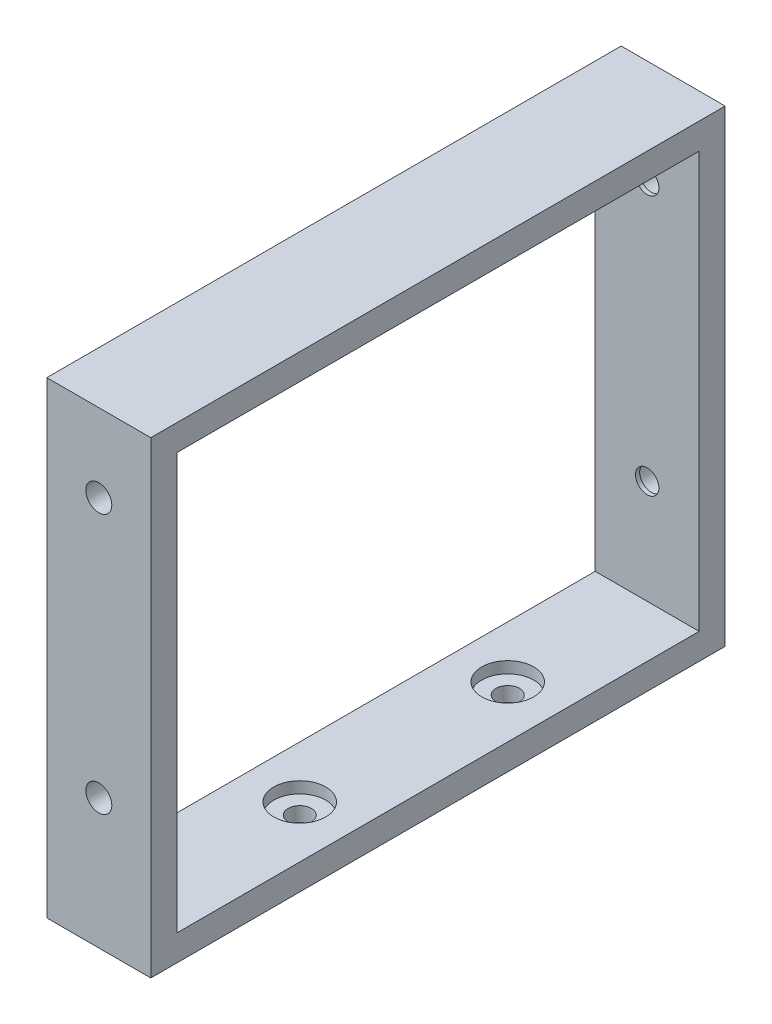
ISO-10303-21;
HEADER;
FILE_DESCRIPTION(('STEP AP214'),'2;1');
FILE_NAME('part.step','',(''),(''),'','','');
FILE_SCHEMA(('AUTOMOTIVE_DESIGN { 1 0 10303 214 1 1 1 1 }'));
ENDSEC;
DATA;
#1=APPLICATION_CONTEXT('core data for automotive mechanical design processes');
#2=APPLICATION_PROTOCOL_DEFINITION('international standard','automotive_design',2000,#1);
#3=PRODUCT_CONTEXT('',#1,'mechanical');
#4=PRODUCT('Part','Part','',(#3));
#5=PRODUCT_RELATED_PRODUCT_CATEGORY('part','',(#4));
#6=PRODUCT_DEFINITION_FORMATION('','',#4);
#7=PRODUCT_DEFINITION_CONTEXT('part definition',#1,'design');
#8=PRODUCT_DEFINITION('design','',#6,#7);
#9=PRODUCT_DEFINITION_SHAPE('','',#8);
#10=(LENGTH_UNIT() NAMED_UNIT(*) SI_UNIT(.MILLI.,.METRE.));
#11=(NAMED_UNIT(*) PLANE_ANGLE_UNIT() SI_UNIT($,.RADIAN.));
#12=(NAMED_UNIT(*) SI_UNIT($,.STERADIAN.) SOLID_ANGLE_UNIT());
#13=UNCERTAINTY_MEASURE_WITH_UNIT(LENGTH_MEASURE(1.E-05),#10,'distance_accuracy_value','');
#14=(GEOMETRIC_REPRESENTATION_CONTEXT(3) GLOBAL_UNCERTAINTY_ASSIGNED_CONTEXT((#13)) GLOBAL_UNIT_ASSIGNED_CONTEXT((#10,
#11,#12)) REPRESENTATION_CONTEXT('',''));
#15=CARTESIAN_POINT('',(0.,0.,0.));
#16=DIRECTION('',(0.,0.,1.));
#17=DIRECTION('',(1.,0.,0.));
#18=AXIS2_PLACEMENT_3D('',#15,#16,#17);
#19=CARTESIAN_POINT('',(20.,-45.,0.));
#20=DIRECTION('',(0.,1.,0.));
#21=DIRECTION('',(0.,0.,1.));
#22=AXIS2_PLACEMENT_3D('',#19,#20,#21);
#23=PLANE('',#22);
#24=CARTESIAN_POINT('',(10.,-45.,-23.4125));
#25=DIRECTION('',(0.,1.,0.));
#26=DIRECTION('',(0.,0.,1.));
#27=AXIS2_PLACEMENT_3D('',#24,#25,#26);
#28=CIRCLE('',#27,2.25);
#29=CARTESIAN_POINT('',(10.,-45.,-21.1625));
#30=VERTEX_POINT('',#29);
#31=EDGE_CURVE('E197',#30,#30,#28,.T.);
#32=ORIENTED_EDGE('',*,*,#31,.T.);
#33=EDGE_LOOP('',(#32));
#34=FACE_BOUND('',#33,.T.);
#35=CARTESIAN_POINT('',(10.,-45.,16.5875));
#36=DIRECTION('',(0.,1.,0.));
#37=DIRECTION('',(0.,0.,1.));
#38=AXIS2_PLACEMENT_3D('',#35,#36,#37);
#39=CIRCLE('',#38,2.25);
#40=CARTESIAN_POINT('',(10.,-45.,18.8375));
#41=VERTEX_POINT('',#40);
#42=EDGE_CURVE('E159',#41,#41,#39,.T.);
#43=ORIENTED_EDGE('',*,*,#42,.T.);
#44=EDGE_LOOP('',(#43));
#45=FACE_BOUND('',#44,.T.);
#46=DIRECTION('',(0.,0.,-1.));
#47=VECTOR('',#46,1.);
#48=CARTESIAN_POINT('',(0.,-45.,0.));
#49=LINE('',#48,#47);
#50=CARTESIAN_POINT('',(0.,-45.,55.2375));
#51=VERTEX_POINT('',#50);
#52=CARTESIAN_POINT('',(0.,-45.,-55.2375));
#53=VERTEX_POINT('',#52);
#54=EDGE_CURVE('E155',#51,#53,#49,.T.);
#55=ORIENTED_EDGE('',*,*,#54,.T.);
#56=DIRECTION('',(-1.,0.,0.));
#57=VECTOR('',#56,1.);
#58=CARTESIAN_POINT('',(20.,-45.,-55.2375));
#59=LINE('',#58,#57);
#60=CARTESIAN_POINT('',(20.,-45.,-55.2375));
#61=VERTEX_POINT('',#60);
#62=EDGE_CURVE('E11',#61,#53,#59,.T.);
#63=ORIENTED_EDGE('',*,*,#62,.F.);
#64=DIRECTION('',(0.,0.,-1.));
#65=VECTOR('',#64,1.);
#66=CARTESIAN_POINT('',(20.,-45.,0.));
#67=LINE('',#66,#65);
#68=CARTESIAN_POINT('',(20.,-45.,55.2375));
#69=VERTEX_POINT('',#68);
#70=EDGE_CURVE('E126',#69,#61,#67,.T.);
#71=ORIENTED_EDGE('',*,*,#70,.F.);
#72=DIRECTION('',(-1.,0.,0.));
#73=VECTOR('',#72,1.);
#74=CARTESIAN_POINT('',(20.,-45.,55.2375));
#75=LINE('',#74,#73);
#76=EDGE_CURVE('E65',#69,#51,#75,.T.);
#77=ORIENTED_EDGE('',*,*,#76,.T.);
#78=EDGE_LOOP('',(#55,#63,#71,#77));
#79=FACE_BOUND('',#78,.T.);
#80=ADVANCED_FACE('F45',(#34,#45,#79),#23,.F.);
#81=CARTESIAN_POINT('',(20.,0.,-55.2375));
#82=DIRECTION('',(0.,0.,1.));
#83=DIRECTION('',(1.,0.,0.));
#84=AXIS2_PLACEMENT_3D('',#81,#82,#83);
#85=PLANE('',#84);
#86=CARTESIAN_POINT('',(10.,30.,-55.2375));
#87=DIRECTION('',(0.,0.,-1.));
#88=DIRECTION('',(-1.,0.,0.));
#89=AXIS2_PLACEMENT_3D('',#86,#87,#88);
#90=CIRCLE('',#89,2.5);
#91=CARTESIAN_POINT('',(7.5,30.,-55.2375));
#92=VERTEX_POINT('',#91);
#93=EDGE_CURVE('E640',#92,#92,#90,.T.);
#94=ORIENTED_EDGE('',*,*,#93,.F.);
#95=EDGE_LOOP('',(#94));
#96=FACE_BOUND('',#95,.T.);
#97=CARTESIAN_POINT('',(10.,-20.,-55.2375));
#98=DIRECTION('',(0.,0.,-1.));
#99=DIRECTION('',(-1.,0.,0.));
#100=AXIS2_PLACEMENT_3D('',#97,#98,#99);
#101=CIRCLE('',#100,2.5);
#102=CARTESIAN_POINT('',(7.50000000000001,-20.,-55.2375));
#103=VERTEX_POINT('',#102);
#104=EDGE_CURVE('E233',#103,#103,#101,.T.);
#105=ORIENTED_EDGE('',*,*,#104,.F.);
#106=EDGE_LOOP('',(#105));
#107=FACE_BOUND('',#106,.T.);
#108=DIRECTION('',(0.,1.,0.));
#109=VECTOR('',#108,1.);
#110=CARTESIAN_POINT('',(0.,0.,-55.2375));
#111=LINE('',#110,#109);
#112=CARTESIAN_POINT('',(0.,45.,-55.2375));
#113=VERTEX_POINT('',#112);
#114=EDGE_CURVE('E133',#53,#113,#111,.T.);
#115=ORIENTED_EDGE('',*,*,#114,.T.);
#116=DIRECTION('',(-1.,0.,0.));
#117=VECTOR('',#116,1.);
#118=CARTESIAN_POINT('',(20.,45.,-55.2375));
#119=LINE('',#118,#117);
#120=CARTESIAN_POINT('',(20.,45.,-55.2375));
#121=VERTEX_POINT('',#120);
#122=EDGE_CURVE('E56',#121,#113,#119,.T.);
#123=ORIENTED_EDGE('',*,*,#122,.F.);
#124=DIRECTION('',(0.,1.,0.));
#125=VECTOR('',#124,1.);
#126=CARTESIAN_POINT('',(20.,0.,-55.2375));
#127=LINE('',#126,#125);
#128=EDGE_CURVE('E120',#61,#121,#127,.T.);
#129=ORIENTED_EDGE('',*,*,#128,.F.);
#130=ORIENTED_EDGE('',*,*,#62,.T.);
#131=EDGE_LOOP('',(#115,#123,#129,#130));
#132=FACE_BOUND('',#131,.T.);
#133=ADVANCED_FACE('F132',(#96,#107,#132),#85,.F.);
#134=CARTESIAN_POINT('',(20.,45.,0.));
#135=DIRECTION('',(0.,1.,0.));
#136=DIRECTION('',(0.,0.,1.));
#137=AXIS2_PLACEMENT_3D('',#134,#135,#136);
#138=PLANE('',#137);
#139=DIRECTION('',(0.,0.,-1.));
#140=VECTOR('',#139,1.);
#141=CARTESIAN_POINT('',(0.,45.,0.));
#142=LINE('',#141,#140);
#143=CARTESIAN_POINT('',(0.,45.,55.2375));
#144=VERTEX_POINT('',#143);
#145=EDGE_CURVE('E167',#144,#113,#142,.T.);
#146=ORIENTED_EDGE('',*,*,#145,.F.);
#147=DIRECTION('',(-1.,0.,0.));
#148=VECTOR('',#147,1.);
#149=CARTESIAN_POINT('',(20.,45.,55.2375));
#150=LINE('',#149,#148);
#151=CARTESIAN_POINT('',(20.,45.,55.2375));
#152=VERTEX_POINT('',#151);
#153=EDGE_CURVE('E91',#152,#144,#150,.T.);
#154=ORIENTED_EDGE('',*,*,#153,.F.);
#155=DIRECTION('',(0.,0.,-1.));
#156=VECTOR('',#155,1.);
#157=CARTESIAN_POINT('',(20.,45.,0.));
#158=LINE('',#157,#156);
#159=EDGE_CURVE('E125',#152,#121,#158,.T.);
#160=ORIENTED_EDGE('',*,*,#159,.T.);
#161=ORIENTED_EDGE('',*,*,#122,.T.);
#162=EDGE_LOOP('',(#146,#154,#160,#161));
#163=FACE_BOUND('',#162,.T.);
#164=ADVANCED_FACE('F138',(#163),#138,.T.);
#165=CARTESIAN_POINT('',(20.,-40.,0.));
#166=DIRECTION('',(0.,1.,0.));
#167=DIRECTION('',(0.,0.,1.));
#168=AXIS2_PLACEMENT_3D('',#165,#166,#167);
#169=PLANE('',#168);
#170=DIRECTION('',(-1.,0.,0.));
#171=VECTOR('',#170,1.);
#172=CARTESIAN_POINT('',(20.,-40.,-50.2375));
#173=LINE('',#172,#171);
#174=CARTESIAN_POINT('',(20.,-40.,-50.2375));
#175=VERTEX_POINT('',#174);
#176=CARTESIAN_POINT('',(0.,-40.,-50.2375));
#177=VERTEX_POINT('',#176);
#178=EDGE_CURVE('E143',#175,#177,#173,.T.);
#179=ORIENTED_EDGE('',*,*,#178,.T.);
#180=DIRECTION('',(0.,0.,-1.));
#181=VECTOR('',#180,1.);
#182=CARTESIAN_POINT('',(0.,-40.,0.));
#183=LINE('',#182,#181);
#184=CARTESIAN_POINT('',(0.,-40.,50.2375));
#185=VERTEX_POINT('',#184);
#186=EDGE_CURVE('E147',#185,#177,#183,.T.);
#187=ORIENTED_EDGE('',*,*,#186,.F.);
#188=DIRECTION('',(-1.,0.,0.));
#189=VECTOR('',#188,1.);
#190=CARTESIAN_POINT('',(20.,-40.,50.2375));
#191=LINE('',#190,#189);
#192=CARTESIAN_POINT('',(20.,-40.,50.2375));
#193=VERTEX_POINT('',#192);
#194=EDGE_CURVE('E177',#193,#185,#191,.T.);
#195=ORIENTED_EDGE('',*,*,#194,.F.);
#196=DIRECTION('',(0.,0.,-1.));
#197=VECTOR('',#196,1.);
#198=CARTESIAN_POINT('',(20.,-40.,0.));
#199=LINE('',#198,#197);
#200=EDGE_CURVE('E174',#193,#175,#199,.T.);
#201=ORIENTED_EDGE('',*,*,#200,.T.);
#202=EDGE_LOOP('',(#179,#187,#195,#201));
#203=FACE_BOUND('',#202,.T.);
#204=CARTESIAN_POINT('',(10.,-40.,-23.4125));
#205=DIRECTION('',(0.,1.,0.));
#206=DIRECTION('',(0.,0.,1.));
#207=AXIS2_PLACEMENT_3D('',#204,#205,#206);
#208=CIRCLE('',#207,5.);
#209=CARTESIAN_POINT('',(10.,-40.,-18.4125));
#210=VERTEX_POINT('',#209);
#211=EDGE_CURVE('E207',#210,#210,#208,.T.);
#212=ORIENTED_EDGE('',*,*,#211,.F.);
#213=EDGE_LOOP('',(#212));
#214=FACE_BOUND('',#213,.T.);
#215=CARTESIAN_POINT('',(10.,-40.,16.5875));
#216=DIRECTION('',(0.,1.,0.));
#217=DIRECTION('',(0.,0.,1.));
#218=AXIS2_PLACEMENT_3D('',#215,#216,#217);
#219=CIRCLE('',#218,5.);
#220=CARTESIAN_POINT('',(10.,-40.,21.5875));
#221=VERTEX_POINT('',#220);
#222=EDGE_CURVE('E201',#221,#221,#219,.T.);
#223=ORIENTED_EDGE('',*,*,#222,.F.);
#224=EDGE_LOOP('',(#223));
#225=FACE_BOUND('',#224,.T.);
#226=ADVANCED_FACE('F297',(#203,#214,#225),#169,.T.);
#227=CARTESIAN_POINT('',(20.,0.,50.2375));
#228=DIRECTION('',(0.,0.,1.));
#229=DIRECTION('',(1.,0.,0.));
#230=AXIS2_PLACEMENT_3D('',#227,#228,#229);
#231=PLANE('',#230);
#232=CARTESIAN_POINT('',(10.,30.,50.2375));
#233=DIRECTION('',(0.,0.,1.));
#234=DIRECTION('',(1.,0.,0.));
#235=AXIS2_PLACEMENT_3D('',#232,#233,#234);
#236=CIRCLE('',#235,2.25);
#237=CARTESIAN_POINT('',(12.25,30.,50.2375));
#238=VERTEX_POINT('',#237);
#239=EDGE_CURVE('E209',#238,#238,#236,.T.);
#240=ORIENTED_EDGE('',*,*,#239,.T.);
#241=EDGE_LOOP('',(#240));
#242=FACE_BOUND('',#241,.T.);
#243=CARTESIAN_POINT('',(10.,-20.,50.2375));
#244=DIRECTION('',(0.,0.,1.));
#245=DIRECTION('',(1.,0.,0.));
#246=AXIS2_PLACEMENT_3D('',#243,#244,#245);
#247=CIRCLE('',#246,2.25);
#248=CARTESIAN_POINT('',(12.25,-20.,50.2375));
#249=VERTEX_POINT('',#248);
#250=EDGE_CURVE('E203',#249,#249,#247,.T.);
#251=ORIENTED_EDGE('',*,*,#250,.T.);
#252=EDGE_LOOP('',(#251));
#253=FACE_BOUND('',#252,.T.);
#254=DIRECTION('',(0.,1.,0.));
#255=VECTOR('',#254,1.);
#256=CARTESIAN_POINT('',(0.,0.,50.2375));
#257=LINE('',#256,#255);
#258=CARTESIAN_POINT('',(0.,40.,50.2375));
#259=VERTEX_POINT('',#258);
#260=EDGE_CURVE('E150',#185,#259,#257,.T.);
#261=ORIENTED_EDGE('',*,*,#260,.T.);
#262=DIRECTION('',(-1.,0.,0.));
#263=VECTOR('',#262,1.);
#264=CARTESIAN_POINT('',(20.,40.,50.2375));
#265=LINE('',#264,#263);
#266=CARTESIAN_POINT('',(20.,40.,50.2375));
#267=VERTEX_POINT('',#266);
#268=EDGE_CURVE('E180',#267,#259,#265,.T.);
#269=ORIENTED_EDGE('',*,*,#268,.F.);
#270=DIRECTION('',(0.,1.,0.));
#271=VECTOR('',#270,1.);
#272=CARTESIAN_POINT('',(20.,0.,50.2375));
#273=LINE('',#272,#271);
#274=EDGE_CURVE('E282',#193,#267,#273,.T.);
#275=ORIENTED_EDGE('',*,*,#274,.F.);
#276=ORIENTED_EDGE('',*,*,#194,.T.);
#277=EDGE_LOOP('',(#261,#269,#275,#276));
#278=FACE_BOUND('',#277,.T.);
#279=ADVANCED_FACE('F289',(#242,#253,#278),#231,.F.);
#280=CARTESIAN_POINT('',(20.,40.,0.));
#281=DIRECTION('',(0.,1.,0.));
#282=DIRECTION('',(0.,0.,1.));
#283=AXIS2_PLACEMENT_3D('',#280,#281,#282);
#284=PLANE('',#283);
#285=DIRECTION('',(0.,0.,-1.));
#286=VECTOR('',#285,1.);
#287=CARTESIAN_POINT('',(0.,40.,0.));
#288=LINE('',#287,#286);
#289=CARTESIAN_POINT('',(0.,40.,-50.2375));
#290=VERTEX_POINT('',#289);
#291=EDGE_CURVE('E152',#259,#290,#288,.T.);
#292=ORIENTED_EDGE('',*,*,#291,.T.);
#293=DIRECTION('',(-1.,0.,0.));
#294=VECTOR('',#293,1.);
#295=CARTESIAN_POINT('',(20.,40.,-50.2375));
#296=LINE('',#295,#294);
#297=CARTESIAN_POINT('',(20.,40.,-50.2375));
#298=VERTEX_POINT('',#297);
#299=EDGE_CURVE('E184',#298,#290,#296,.T.);
#300=ORIENTED_EDGE('',*,*,#299,.F.);
#301=DIRECTION('',(0.,0.,-1.));
#302=VECTOR('',#301,1.);
#303=CARTESIAN_POINT('',(20.,40.,0.));
#304=LINE('',#303,#302);
#305=EDGE_CURVE('E104',#267,#298,#304,.T.);
#306=ORIENTED_EDGE('',*,*,#305,.F.);
#307=ORIENTED_EDGE('',*,*,#268,.T.);
#308=EDGE_LOOP('',(#292,#300,#306,#307));
#309=FACE_BOUND('',#308,.T.);
#310=ADVANCED_FACE('F292',(#309),#284,.F.);
#311=CARTESIAN_POINT('',(20.,0.,-50.2375));
#312=DIRECTION('',(0.,0.,1.));
#313=DIRECTION('',(1.,0.,0.));
#314=AXIS2_PLACEMENT_3D('',#311,#312,#313);
#315=PLANE('',#314);
#316=CARTESIAN_POINT('',(10.,30.,-50.2375));
#317=DIRECTION('',(0.,0.,1.));
#318=DIRECTION('',(1.,0.,0.));
#319=AXIS2_PLACEMENT_3D('',#316,#317,#318);
#320=CIRCLE('',#319,2.25);
#321=CARTESIAN_POINT('',(12.25,30.,-50.2375));
#322=VERTEX_POINT('',#321);
#323=EDGE_CURVE('E49',#322,#322,#320,.T.);
#324=ORIENTED_EDGE('',*,*,#323,.F.);
#325=EDGE_LOOP('',(#324));
#326=FACE_BOUND('',#325,.T.);
#327=CARTESIAN_POINT('',(10.,-20.,-50.2375));
#328=DIRECTION('',(0.,0.,1.));
#329=DIRECTION('',(1.,0.,0.));
#330=AXIS2_PLACEMENT_3D('',#327,#328,#329);
#331=CIRCLE('',#330,2.25);
#332=CARTESIAN_POINT('',(12.25,-20.,-50.2375));
#333=VERTEX_POINT('',#332);
#334=EDGE_CURVE('E214',#333,#333,#331,.T.);
#335=ORIENTED_EDGE('',*,*,#334,.F.);
#336=EDGE_LOOP('',(#335));
#337=FACE_BOUND('',#336,.T.);
#338=DIRECTION('',(0.,1.,0.));
#339=VECTOR('',#338,1.);
#340=CARTESIAN_POINT('',(0.,0.,-50.2375));
#341=LINE('',#340,#339);
#342=EDGE_CURVE('E151',#177,#290,#341,.T.);
#343=ORIENTED_EDGE('',*,*,#342,.F.);
#344=ORIENTED_EDGE('',*,*,#178,.F.);
#345=DIRECTION('',(0.,1.,0.));
#346=VECTOR('',#345,1.);
#347=CARTESIAN_POINT('',(20.,0.,-50.2375));
#348=LINE('',#347,#346);
#349=EDGE_CURVE('E278',#175,#298,#348,.T.);
#350=ORIENTED_EDGE('',*,*,#349,.T.);
#351=ORIENTED_EDGE('',*,*,#299,.T.);
#352=EDGE_LOOP('',(#343,#344,#350,#351));
#353=FACE_BOUND('',#352,.T.);
#354=ADVANCED_FACE('F47',(#326,#337,#353),#315,.T.);
#355=CARTESIAN_POINT('',(20.,0.,55.2375));
#356=DIRECTION('',(0.,0.,1.));
#357=DIRECTION('',(1.,0.,0.));
#358=AXIS2_PLACEMENT_3D('',#355,#356,#357);
#359=PLANE('',#358);
#360=CARTESIAN_POINT('',(10.,30.,55.2375));
#361=DIRECTION('',(0.,0.,1.));
#362=DIRECTION('',(1.,0.,0.));
#363=AXIS2_PLACEMENT_3D('',#360,#361,#362);
#364=CIRCLE('',#363,2.5);
#365=CARTESIAN_POINT('',(12.5,30.,55.2375));
#366=VERTEX_POINT('',#365);
#367=EDGE_CURVE('E217',#366,#366,#364,.T.);
#368=ORIENTED_EDGE('',*,*,#367,.F.);
#369=EDGE_LOOP('',(#368));
#370=FACE_BOUND('',#369,.T.);
#371=CARTESIAN_POINT('',(10.,-20.,55.2375));
#372=DIRECTION('',(0.,0.,1.));
#373=DIRECTION('',(1.,0.,0.));
#374=AXIS2_PLACEMENT_3D('',#371,#372,#373);
#375=CIRCLE('',#374,2.5);
#376=CARTESIAN_POINT('',(12.5,-20.,55.2375));
#377=VERTEX_POINT('',#376);
#378=EDGE_CURVE('E212',#377,#377,#375,.T.);
#379=ORIENTED_EDGE('',*,*,#378,.F.);
#380=EDGE_LOOP('',(#379));
#381=FACE_BOUND('',#380,.T.);
#382=DIRECTION('',(0.,1.,0.));
#383=VECTOR('',#382,1.);
#384=CARTESIAN_POINT('',(0.,0.,55.2375));
#385=LINE('',#384,#383);
#386=EDGE_CURVE('E170',#51,#144,#385,.T.);
#387=ORIENTED_EDGE('',*,*,#386,.F.);
#388=ORIENTED_EDGE('',*,*,#76,.F.);
#389=DIRECTION('',(0.,1.,0.));
#390=VECTOR('',#389,1.);
#391=CARTESIAN_POINT('',(20.,0.,55.2375));
#392=LINE('',#391,#390);
#393=EDGE_CURVE('E140',#69,#152,#392,.T.);
#394=ORIENTED_EDGE('',*,*,#393,.T.);
#395=ORIENTED_EDGE('',*,*,#153,.T.);
#396=EDGE_LOOP('',(#387,#388,#394,#395));
#397=FACE_BOUND('',#396,.T.);
#398=ADVANCED_FACE('F305',(#370,#381,#397),#359,.T.);
#399=CARTESIAN_POINT('',(20.,0.,0.));
#400=DIRECTION('',(1.,0.,0.));
#401=DIRECTION('',(0.,0.,-1.));
#402=AXIS2_PLACEMENT_3D('',#399,#400,#401);
#403=PLANE('',#402);
#404=ORIENTED_EDGE('',*,*,#274,.T.);
#405=ORIENTED_EDGE('',*,*,#305,.T.);
#406=ORIENTED_EDGE('',*,*,#349,.F.);
#407=ORIENTED_EDGE('',*,*,#200,.F.);
#408=EDGE_LOOP('',(#404,#405,#406,#407));
#409=FACE_BOUND('',#408,.T.);
#410=ORIENTED_EDGE('',*,*,#70,.T.);
#411=ORIENTED_EDGE('',*,*,#128,.T.);
#412=ORIENTED_EDGE('',*,*,#159,.F.);
#413=ORIENTED_EDGE('',*,*,#393,.F.);
#414=EDGE_LOOP('',(#410,#411,#412,#413));
#415=FACE_BOUND('',#414,.T.);
#416=ADVANCED_FACE('F122',(#409,#415),#403,.T.);
#417=CARTESIAN_POINT('',(0.,0.,0.));
#418=DIRECTION('',(1.,0.,0.));
#419=DIRECTION('',(0.,0.,-1.));
#420=AXIS2_PLACEMENT_3D('',#417,#418,#419);
#421=PLANE('',#420);
#422=ORIENTED_EDGE('',*,*,#342,.T.);
#423=ORIENTED_EDGE('',*,*,#291,.F.);
#424=ORIENTED_EDGE('',*,*,#260,.F.);
#425=ORIENTED_EDGE('',*,*,#186,.T.);
#426=EDGE_LOOP('',(#422,#423,#424,#425));
#427=FACE_BOUND('',#426,.T.);
#428=ORIENTED_EDGE('',*,*,#54,.F.);
#429=ORIENTED_EDGE('',*,*,#386,.T.);
#430=ORIENTED_EDGE('',*,*,#145,.T.);
#431=ORIENTED_EDGE('',*,*,#114,.F.);
#432=EDGE_LOOP('',(#428,#429,#430,#431));
#433=FACE_BOUND('',#432,.T.);
#434=ADVANCED_FACE('F300',(#427,#433),#421,.F.);
#435=CARTESIAN_POINT('',(10.,-40.,16.5875));
#436=DIRECTION('',(0.,1.,0.));
#437=DIRECTION('',(0.,0.,1.));
#438=AXIS2_PLACEMENT_3D('',#435,#436,#437);
#439=CYLINDRICAL_SURFACE('',#438,2.25);
#440=CARTESIAN_POINT('',(10.,-42.2,16.5875));
#441=DIRECTION('',(0.,1.,0.));
#442=DIRECTION('',(0.,0.,1.));
#443=AXIS2_PLACEMENT_3D('',#440,#441,#442);
#444=CIRCLE('',#443,2.25);
#445=CARTESIAN_POINT('',(10.,-42.2,18.8375));
#446=VERTEX_POINT('',#445);
#447=EDGE_CURVE('E196',#446,#446,#444,.T.);
#448=ORIENTED_EDGE('',*,*,#447,.T.);
#449=EDGE_LOOP('',(#448));
#450=FACE_BOUND('',#449,.T.);
#451=ORIENTED_EDGE('',*,*,#42,.F.);
#452=EDGE_LOOP('',(#451));
#453=FACE_BOUND('',#452,.T.);
#454=ADVANCED_FACE('F303',(#450,#453),#439,.F.);
#455=CARTESIAN_POINT('',(12.25,-42.2,16.5875));
#456=DIRECTION('',(0.,-1.,0.));
#457=DIRECTION('',(0.,0.,-1.));
#458=AXIS2_PLACEMENT_3D('',#455,#456,#457);
#459=PLANE('',#458);
#460=ORIENTED_EDGE('',*,*,#447,.F.);
#461=EDGE_LOOP('',(#460));
#462=FACE_BOUND('',#461,.T.);
#463=CARTESIAN_POINT('',(10.,-42.2,16.5875));
#464=DIRECTION('',(0.,1.,0.));
#465=DIRECTION('',(0.,0.,1.));
#466=AXIS2_PLACEMENT_3D('',#463,#464,#465);
#467=CIRCLE('',#466,5.);
#468=CARTESIAN_POINT('',(10.,-42.2,21.5875));
#469=VERTEX_POINT('',#468);
#470=EDGE_CURVE('E266',#469,#469,#467,.T.);
#471=ORIENTED_EDGE('',*,*,#470,.T.);
#472=EDGE_LOOP('',(#471));
#473=FACE_BOUND('',#472,.T.);
#474=ADVANCED_FACE('F522',(#462,#473),#459,.F.);
#475=CARTESIAN_POINT('',(10.,-40.,16.5875));
#476=DIRECTION('',(0.,1.,0.));
#477=DIRECTION('',(0.,0.,1.));
#478=AXIS2_PLACEMENT_3D('',#475,#476,#477);
#479=CYLINDRICAL_SURFACE('',#478,5.);
#480=ORIENTED_EDGE('',*,*,#470,.F.);
#481=EDGE_LOOP('',(#480));
#482=FACE_BOUND('',#481,.T.);
#483=ORIENTED_EDGE('',*,*,#222,.T.);
#484=EDGE_LOOP('',(#483));
#485=FACE_BOUND('',#484,.T.);
#486=ADVANCED_FACE('F518',(#482,#485),#479,.F.);
#487=CARTESIAN_POINT('',(10.,-40.,-23.4125));
#488=DIRECTION('',(0.,1.,0.));
#489=DIRECTION('',(0.,0.,1.));
#490=AXIS2_PLACEMENT_3D('',#487,#488,#489);
#491=CYLINDRICAL_SURFACE('',#490,2.25);
#492=CARTESIAN_POINT('',(10.,-42.2,-23.4125));
#493=DIRECTION('',(0.,1.,0.));
#494=DIRECTION('',(0.,0.,1.));
#495=AXIS2_PLACEMENT_3D('',#492,#493,#494);
#496=CIRCLE('',#495,2.25);
#497=CARTESIAN_POINT('',(10.,-42.2,-21.1625));
#498=VERTEX_POINT('',#497);
#499=EDGE_CURVE('E202',#498,#498,#496,.T.);
#500=ORIENTED_EDGE('',*,*,#499,.T.);
#501=EDGE_LOOP('',(#500));
#502=FACE_BOUND('',#501,.T.);
#503=ORIENTED_EDGE('',*,*,#31,.F.);
#504=EDGE_LOOP('',(#503));
#505=FACE_BOUND('',#504,.T.);
#506=ADVANCED_FACE('F515',(#502,#505),#491,.F.);
#507=CARTESIAN_POINT('',(12.25,-42.2,-23.4125));
#508=DIRECTION('',(0.,-1.,0.));
#509=DIRECTION('',(0.,0.,-1.));
#510=AXIS2_PLACEMENT_3D('',#507,#508,#509);
#511=PLANE('',#510);
#512=ORIENTED_EDGE('',*,*,#499,.F.);
#513=EDGE_LOOP('',(#512));
#514=FACE_BOUND('',#513,.T.);
#515=CARTESIAN_POINT('',(10.,-42.2,-23.4125));
#516=DIRECTION('',(0.,1.,0.));
#517=DIRECTION('',(0.,0.,1.));
#518=AXIS2_PLACEMENT_3D('',#515,#516,#517);
#519=CIRCLE('',#518,5.);
#520=CARTESIAN_POINT('',(10.,-42.2,-18.4125));
#521=VERTEX_POINT('',#520);
#522=EDGE_CURVE('E256',#521,#521,#519,.T.);
#523=ORIENTED_EDGE('',*,*,#522,.T.);
#524=EDGE_LOOP('',(#523));
#525=FACE_BOUND('',#524,.T.);
#526=ADVANCED_FACE('F459',(#514,#525),#511,.F.);
#527=CARTESIAN_POINT('',(10.,-40.,-23.4125));
#528=DIRECTION('',(0.,1.,0.));
#529=DIRECTION('',(0.,0.,1.));
#530=AXIS2_PLACEMENT_3D('',#527,#528,#529);
#531=CYLINDRICAL_SURFACE('',#530,5.);
#532=ORIENTED_EDGE('',*,*,#522,.F.);
#533=EDGE_LOOP('',(#532));
#534=FACE_BOUND('',#533,.T.);
#535=ORIENTED_EDGE('',*,*,#211,.T.);
#536=EDGE_LOOP('',(#535));
#537=FACE_BOUND('',#536,.T.);
#538=ADVANCED_FACE('F454',(#534,#537),#531,.F.);
#539=CARTESIAN_POINT('',(10.,-20.,55.2375));
#540=DIRECTION('',(0.,0.,1.));
#541=DIRECTION('',(1.,0.,0.));
#542=AXIS2_PLACEMENT_3D('',#539,#540,#541);
#543=CYLINDRICAL_SURFACE('',#542,2.25);
#544=CARTESIAN_POINT('',(10.,-20.,51.0375));
#545=DIRECTION('',(0.,0.,1.));
#546=DIRECTION('',(1.,0.,0.));
#547=AXIS2_PLACEMENT_3D('',#544,#545,#546);
#548=CIRCLE('',#547,2.25);
#549=CARTESIAN_POINT('',(12.25,-20.,51.0375));
#550=VERTEX_POINT('',#549);
#551=EDGE_CURVE('E208',#550,#550,#548,.T.);
#552=ORIENTED_EDGE('',*,*,#551,.T.);
#553=EDGE_LOOP('',(#552));
#554=FACE_BOUND('',#553,.T.);
#555=ORIENTED_EDGE('',*,*,#250,.F.);
#556=EDGE_LOOP('',(#555));
#557=FACE_BOUND('',#556,.T.);
#558=ADVANCED_FACE('F458',(#554,#557),#543,.F.);
#559=CARTESIAN_POINT('',(12.25,-20.,51.0375));
#560=DIRECTION('',(0.,0.,-1.));
#561=DIRECTION('',(-1.,0.,0.));
#562=AXIS2_PLACEMENT_3D('',#559,#560,#561);
#563=PLANE('',#562);
#564=ORIENTED_EDGE('',*,*,#551,.F.);
#565=EDGE_LOOP('',(#564));
#566=FACE_BOUND('',#565,.T.);
#567=CARTESIAN_POINT('',(10.,-20.,51.0375));
#568=DIRECTION('',(0.,0.,1.));
#569=DIRECTION('',(1.,0.,0.));
#570=AXIS2_PLACEMENT_3D('',#567,#568,#569);
#571=CIRCLE('',#570,2.5);
#572=CARTESIAN_POINT('',(12.5,-20.,51.0375));
#573=VERTEX_POINT('',#572);
#574=EDGE_CURVE('E246',#573,#573,#571,.T.);
#575=ORIENTED_EDGE('',*,*,#574,.T.);
#576=EDGE_LOOP('',(#575));
#577=FACE_BOUND('',#576,.T.);
#578=ADVANCED_FACE('F475',(#566,#577),#563,.F.);
#579=CARTESIAN_POINT('',(10.,-20.,55.2375));
#580=DIRECTION('',(0.,0.,1.));
#581=DIRECTION('',(1.,0.,0.));
#582=AXIS2_PLACEMENT_3D('',#579,#580,#581);
#583=CYLINDRICAL_SURFACE('',#582,2.5);
#584=ORIENTED_EDGE('',*,*,#574,.F.);
#585=EDGE_LOOP('',(#584));
#586=FACE_BOUND('',#585,.T.);
#587=ORIENTED_EDGE('',*,*,#378,.T.);
#588=EDGE_LOOP('',(#587));
#589=FACE_BOUND('',#588,.T.);
#590=ADVANCED_FACE('F482',(#586,#589),#583,.F.);
#591=CARTESIAN_POINT('',(10.,30.,55.2375));
#592=DIRECTION('',(0.,0.,1.));
#593=DIRECTION('',(1.,0.,0.));
#594=AXIS2_PLACEMENT_3D('',#591,#592,#593);
#595=CYLINDRICAL_SURFACE('',#594,2.25);
#596=CARTESIAN_POINT('',(10.,30.,51.0375));
#597=DIRECTION('',(0.,0.,1.));
#598=DIRECTION('',(1.,0.,0.));
#599=AXIS2_PLACEMENT_3D('',#596,#597,#598);
#600=CIRCLE('',#599,2.25);
#601=CARTESIAN_POINT('',(12.25,30.,51.0375));
#602=VERTEX_POINT('',#601);
#603=EDGE_CURVE('E213',#602,#602,#600,.T.);
#604=ORIENTED_EDGE('',*,*,#603,.T.);
#605=EDGE_LOOP('',(#604));
#606=FACE_BOUND('',#605,.T.);
#607=ORIENTED_EDGE('',*,*,#239,.F.);
#608=EDGE_LOOP('',(#607));
#609=FACE_BOUND('',#608,.T.);
#610=ADVANCED_FACE('F490',(#606,#609),#595,.F.);
#611=CARTESIAN_POINT('',(12.25,30.,51.0375));
#612=DIRECTION('',(0.,0.,-1.));
#613=DIRECTION('',(-1.,0.,0.));
#614=AXIS2_PLACEMENT_3D('',#611,#612,#613);
#615=PLANE('',#614);
#616=ORIENTED_EDGE('',*,*,#603,.F.);
#617=EDGE_LOOP('',(#616));
#618=FACE_BOUND('',#617,.T.);
#619=CARTESIAN_POINT('',(10.,30.,51.0375));
#620=DIRECTION('',(0.,0.,1.));
#621=DIRECTION('',(1.,0.,0.));
#622=AXIS2_PLACEMENT_3D('',#619,#620,#621);
#623=CIRCLE('',#622,2.5);
#624=CARTESIAN_POINT('',(12.5,30.,51.0375));
#625=VERTEX_POINT('',#624);
#626=EDGE_CURVE('E224',#625,#625,#623,.T.);
#627=ORIENTED_EDGE('',*,*,#626,.T.);
#628=EDGE_LOOP('',(#627));
#629=FACE_BOUND('',#628,.T.);
#630=ADVANCED_FACE('F497',(#618,#629),#615,.F.);
#631=CARTESIAN_POINT('',(10.,30.,55.2375));
#632=DIRECTION('',(0.,0.,1.));
#633=DIRECTION('',(1.,0.,0.));
#634=AXIS2_PLACEMENT_3D('',#631,#632,#633);
#635=CYLINDRICAL_SURFACE('',#634,2.5);
#636=ORIENTED_EDGE('',*,*,#626,.F.);
#637=EDGE_LOOP('',(#636));
#638=FACE_BOUND('',#637,.T.);
#639=ORIENTED_EDGE('',*,*,#367,.T.);
#640=EDGE_LOOP('',(#639));
#641=FACE_BOUND('',#640,.T.);
#642=ADVANCED_FACE('F349',(#638,#641),#635,.F.);
#643=CARTESIAN_POINT('',(10.,-20.,-55.2375));
#644=DIRECTION('',(0.,0.,-1.));
#645=DIRECTION('',(-1.,0.,0.));
#646=AXIS2_PLACEMENT_3D('',#643,#644,#645);
#647=CYLINDRICAL_SURFACE('',#646,2.25);
#648=ORIENTED_EDGE('',*,*,#334,.T.);
#649=EDGE_LOOP('',(#648));
#650=FACE_BOUND('',#649,.T.);
#651=CARTESIAN_POINT('',(10.,-20.,-51.0375));
#652=DIRECTION('',(0.,0.,-1.));
#653=DIRECTION('',(-1.,0.,0.));
#654=AXIS2_PLACEMENT_3D('',#651,#652,#653);
#655=CIRCLE('',#654,2.25);
#656=CARTESIAN_POINT('',(7.75000000000001,-20.,-51.0375));
#657=VERTEX_POINT('',#656);
#658=EDGE_CURVE('E218',#657,#657,#655,.T.);
#659=ORIENTED_EDGE('',*,*,#658,.T.);
#660=EDGE_LOOP('',(#659));
#661=FACE_BOUND('',#660,.T.);
#662=ADVANCED_FACE('F362',(#650,#661),#647,.F.);
#663=CARTESIAN_POINT('',(12.25,-20.,-51.0375));
#664=DIRECTION('',(0.,0.,1.));
#665=DIRECTION('',(1.,0.,0.));
#666=AXIS2_PLACEMENT_3D('',#663,#664,#665);
#667=PLANE('',#666);
#668=ORIENTED_EDGE('',*,*,#658,.F.);
#669=EDGE_LOOP('',(#668));
#670=FACE_BOUND('',#669,.T.);
#671=CARTESIAN_POINT('',(10.,-20.,-51.0375));
#672=DIRECTION('',(0.,0.,-1.));
#673=DIRECTION('',(-1.,0.,0.));
#674=AXIS2_PLACEMENT_3D('',#671,#672,#673);
#675=CIRCLE('',#674,2.5);
#676=CARTESIAN_POINT('',(7.50000000000001,-20.,-51.0375));
#677=VERTEX_POINT('',#676);
#678=EDGE_CURVE('E227',#677,#677,#675,.T.);
#679=ORIENTED_EDGE('',*,*,#678,.T.);
#680=EDGE_LOOP('',(#679));
#681=FACE_BOUND('',#680,.T.);
#682=ADVANCED_FACE('F367',(#670,#681),#667,.F.);
#683=CARTESIAN_POINT('',(10.,-20.,-55.2375));
#684=DIRECTION('',(0.,0.,-1.));
#685=DIRECTION('',(-1.,0.,0.));
#686=AXIS2_PLACEMENT_3D('',#683,#684,#685);
#687=CYLINDRICAL_SURFACE('',#686,2.5);
#688=ORIENTED_EDGE('',*,*,#678,.F.);
#689=EDGE_LOOP('',(#688));
#690=FACE_BOUND('',#689,.T.);
#691=ORIENTED_EDGE('',*,*,#104,.T.);
#692=EDGE_LOOP('',(#691));
#693=FACE_BOUND('',#692,.T.);
#694=ADVANCED_FACE('F377',(#690,#693),#687,.F.);
#695=CARTESIAN_POINT('',(10.,30.,-55.2375));
#696=DIRECTION('',(0.,0.,-1.));
#697=DIRECTION('',(-1.,0.,0.));
#698=AXIS2_PLACEMENT_3D('',#695,#696,#697);
#699=CYLINDRICAL_SURFACE('',#698,2.25);
#700=ORIENTED_EDGE('',*,*,#323,.T.);
#701=EDGE_LOOP('',(#700));
#702=FACE_BOUND('',#701,.T.);
#703=CARTESIAN_POINT('',(10.,30.,-51.0375));
#704=DIRECTION('',(0.,0.,-1.));
#705=DIRECTION('',(-1.,0.,0.));
#706=AXIS2_PLACEMENT_3D('',#703,#704,#705);
#707=CIRCLE('',#706,2.25);
#708=CARTESIAN_POINT('',(7.75,30.,-51.0375));
#709=VERTEX_POINT('',#708);
#710=EDGE_CURVE('E644',#709,#709,#707,.T.);
#711=ORIENTED_EDGE('',*,*,#710,.T.);
#712=EDGE_LOOP('',(#711));
#713=FACE_BOUND('',#712,.T.);
#714=ADVANCED_FACE('F388',(#702,#713),#699,.F.);
#715=CARTESIAN_POINT('',(12.25,30.,-51.0375));
#716=DIRECTION('',(0.,0.,1.));
#717=DIRECTION('',(1.,0.,0.));
#718=AXIS2_PLACEMENT_3D('',#715,#716,#717);
#719=PLANE('',#718);
#720=ORIENTED_EDGE('',*,*,#710,.F.);
#721=EDGE_LOOP('',(#720));
#722=FACE_BOUND('',#721,.T.);
#723=CARTESIAN_POINT('',(10.,30.,-51.0375));
#724=DIRECTION('',(0.,0.,-1.));
#725=DIRECTION('',(-1.,0.,0.));
#726=AXIS2_PLACEMENT_3D('',#723,#724,#725);
#727=CIRCLE('',#726,2.5);
#728=CARTESIAN_POINT('',(7.5,30.,-51.0375));
#729=VERTEX_POINT('',#728);
#730=EDGE_CURVE('E637',#729,#729,#727,.T.);
#731=ORIENTED_EDGE('',*,*,#730,.T.);
#732=EDGE_LOOP('',(#731));
#733=FACE_BOUND('',#732,.T.);
#734=ADVANCED_FACE('F399',(#722,#733),#719,.F.);
#735=CARTESIAN_POINT('',(10.,30.,-55.2375));
#736=DIRECTION('',(0.,0.,-1.));
#737=DIRECTION('',(-1.,0.,0.));
#738=AXIS2_PLACEMENT_3D('',#735,#736,#737);
#739=CYLINDRICAL_SURFACE('',#738,2.5);
#740=ORIENTED_EDGE('',*,*,#730,.F.);
#741=EDGE_LOOP('',(#740));
#742=FACE_BOUND('',#741,.T.);
#743=ORIENTED_EDGE('',*,*,#93,.T.);
#744=EDGE_LOOP('',(#743));
#745=FACE_BOUND('',#744,.T.);
#746=ADVANCED_FACE('F409',(#742,#745),#739,.F.);
#747=CLOSED_SHELL('',(#80,#133,#164,#226,#279,#310,#354,#398,#416,#434,#454,#474,#486,#506,#526,
#538,#558,#578,#590,#610,#630,#642,#662,#682,#694,#714,#734,#746));
#748=MANIFOLD_SOLID_BREP('B2',#747);
#749=ADVANCED_BREP_SHAPE_REPRESENTATION('',(#18,#748),#14);
#750=SHAPE_DEFINITION_REPRESENTATION(#9,#749);
ENDSEC;
END-ISO-10303-21;
